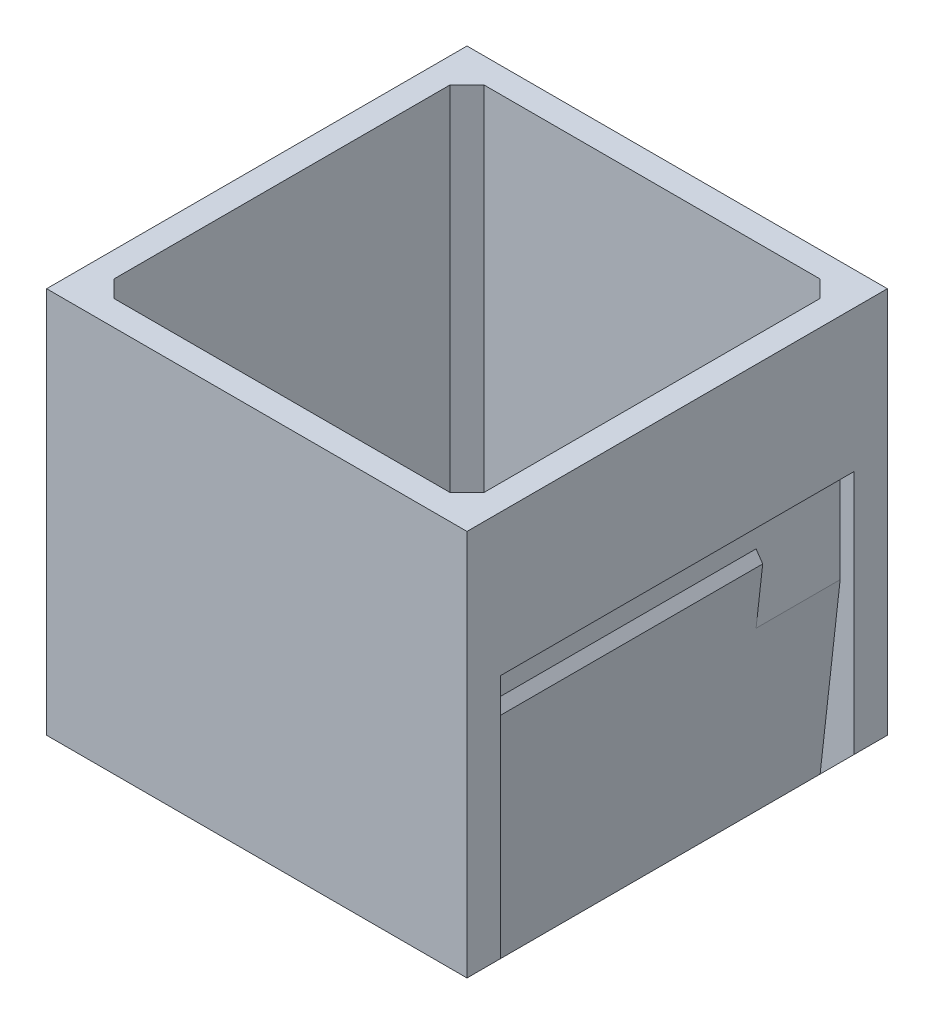
ISO-10303-21;
HEADER;
FILE_DESCRIPTION(('STEP AP214'),'2;1');
FILE_NAME('part.step','',(''),(''),'','','');
FILE_SCHEMA(('AUTOMOTIVE_DESIGN { 1 0 10303 214 1 1 1 1 }'));
ENDSEC;
DATA;
#1=APPLICATION_CONTEXT('core data for automotive mechanical design processes');
#2=APPLICATION_PROTOCOL_DEFINITION('international standard','automotive_design',2000,#1);
#3=PRODUCT_CONTEXT('',#1,'mechanical');
#4=PRODUCT('Part','Part','',(#3));
#5=PRODUCT_RELATED_PRODUCT_CATEGORY('part','',(#4));
#6=PRODUCT_DEFINITION_FORMATION('','',#4);
#7=PRODUCT_DEFINITION_CONTEXT('part definition',#1,'design');
#8=PRODUCT_DEFINITION('design','',#6,#7);
#9=PRODUCT_DEFINITION_SHAPE('','',#8);
#10=(LENGTH_UNIT() NAMED_UNIT(*) SI_UNIT(.MILLI.,.METRE.));
#11=(NAMED_UNIT(*) PLANE_ANGLE_UNIT() SI_UNIT($,.RADIAN.));
#12=(NAMED_UNIT(*) SI_UNIT($,.STERADIAN.) SOLID_ANGLE_UNIT());
#13=UNCERTAINTY_MEASURE_WITH_UNIT(LENGTH_MEASURE(1.E-05),#10,'distance_accuracy_value','');
#14=(GEOMETRIC_REPRESENTATION_CONTEXT(3) GLOBAL_UNCERTAINTY_ASSIGNED_CONTEXT((#13)) GLOBAL_UNIT_ASSIGNED_CONTEXT((#10,
#11,#12)) REPRESENTATION_CONTEXT('',''));
#15=CARTESIAN_POINT('',(0.,0.,0.));
#16=DIRECTION('',(0.,0.,1.));
#17=DIRECTION('',(1.,0.,0.));
#18=AXIS2_PLACEMENT_3D('',#15,#16,#17);
#19=CARTESIAN_POINT('',(0.,25.,0.));
#20=DIRECTION('',(0.,-1.,0.));
#21=DIRECTION('',(0.,0.,-1.));
#22=AXIS2_PLACEMENT_3D('',#19,#20,#21);
#23=PLANE('',#22);
#24=DIRECTION('',(0.,0.,-1.));
#25=VECTOR('',#24,1.);
#26=CARTESIAN_POINT('',(12.5,25.,12.5));
#27=LINE('',#26,#25);
#28=CARTESIAN_POINT('',(12.5,25.,12.5));
#29=VERTEX_POINT('',#28);
#30=CARTESIAN_POINT('',(12.5,25.,-12.5));
#31=VERTEX_POINT('',#30);
#32=EDGE_CURVE('E373',#29,#31,#27,.T.);
#33=ORIENTED_EDGE('',*,*,#32,.T.);
#34=DIRECTION('',(-1.,0.,0.));
#35=VECTOR('',#34,1.);
#36=CARTESIAN_POINT('',(-12.5,25.,-12.5));
#37=LINE('',#36,#35);
#38=CARTESIAN_POINT('',(-12.5,25.,-12.5));
#39=VERTEX_POINT('',#38);
#40=EDGE_CURVE('E377',#31,#39,#37,.T.);
#41=ORIENTED_EDGE('',*,*,#40,.T.);
#42=DIRECTION('',(0.,0.,1.));
#43=VECTOR('',#42,1.);
#44=CARTESIAN_POINT('',(-12.5,25.,12.5));
#45=LINE('',#44,#43);
#46=CARTESIAN_POINT('',(-12.5,25.,12.5));
#47=VERTEX_POINT('',#46);
#48=EDGE_CURVE('E381',#39,#47,#45,.T.);
#49=ORIENTED_EDGE('',*,*,#48,.T.);
#50=DIRECTION('',(1.,0.,0.));
#51=VECTOR('',#50,1.);
#52=CARTESIAN_POINT('',(-12.5,25.,12.5));
#53=LINE('',#52,#51);
#54=EDGE_CURVE('E384',#47,#29,#53,.T.);
#55=ORIENTED_EDGE('',*,*,#54,.T.);
#56=EDGE_LOOP('',(#33,#41,#49,#55));
#57=FACE_BOUND('',#56,.T.);
#58=DIRECTION('',(0.,0.,-1.));
#59=VECTOR('',#58,1.);
#60=CARTESIAN_POINT('',(11.,25.,0.));
#61=LINE('',#60,#59);
#62=CARTESIAN_POINT('',(11.,25.,10.));
#63=VERTEX_POINT('',#62);
#64=CARTESIAN_POINT('',(11.,25.,-9.99999999999998));
#65=VERTEX_POINT('',#64);
#66=EDGE_CURVE('E273',#63,#65,#61,.T.);
#67=ORIENTED_EDGE('',*,*,#66,.F.);
#68=DIRECTION('',(0.707106781186552,0.,-0.707106781186543));
#69=VECTOR('',#68,1.);
#70=CARTESIAN_POINT('',(10.4999999999999,25.,10.5000000000001));
#71=LINE('',#70,#69);
#72=CARTESIAN_POINT('',(9.99999999999999,25.,11.));
#73=VERTEX_POINT('',#72);
#74=EDGE_CURVE('E510',#63,#73,#71,.F.);
#75=ORIENTED_EDGE('',*,*,#74,.T.);
#76=DIRECTION('',(1.,0.,0.));
#77=VECTOR('',#76,1.);
#78=CARTESIAN_POINT('',(0.,25.,11.));
#79=LINE('',#78,#77);
#80=CARTESIAN_POINT('',(-9.99999999999999,25.,11.));
#81=VERTEX_POINT('',#80);
#82=EDGE_CURVE('E259',#81,#73,#79,.T.);
#83=ORIENTED_EDGE('',*,*,#82,.F.);
#84=DIRECTION('',(0.707106781186544,0.,0.707106781186551));
#85=VECTOR('',#84,1.);
#86=CARTESIAN_POINT('',(-10.5,25.,10.4999999999999));
#87=LINE('',#86,#85);
#88=CARTESIAN_POINT('',(-11.,25.,9.99999999999999));
#89=VERTEX_POINT('',#88);
#90=EDGE_CURVE('E513',#81,#89,#87,.F.);
#91=ORIENTED_EDGE('',*,*,#90,.T.);
#92=DIRECTION('',(0.,0.,1.));
#93=VECTOR('',#92,1.);
#94=CARTESIAN_POINT('',(-11.,25.,0.));
#95=LINE('',#94,#93);
#96=CARTESIAN_POINT('',(-11.,25.,-10.));
#97=VERTEX_POINT('',#96);
#98=EDGE_CURVE('E311',#97,#89,#95,.T.);
#99=ORIENTED_EDGE('',*,*,#98,.F.);
#100=DIRECTION('',(-0.707106781186549,0.,0.707106781186546));
#101=VECTOR('',#100,1.);
#102=CARTESIAN_POINT('',(-10.5,25.,-10.5));
#103=LINE('',#102,#101);
#104=CARTESIAN_POINT('',(-9.99999999999999,25.,-11.));
#105=VERTEX_POINT('',#104);
#106=EDGE_CURVE('E516',#97,#105,#103,.F.);
#107=ORIENTED_EDGE('',*,*,#106,.T.);
#108=DIRECTION('',(-1.,0.,0.));
#109=VECTOR('',#108,1.);
#110=CARTESIAN_POINT('',(0.,25.,-11.));
#111=LINE('',#110,#109);
#112=CARTESIAN_POINT('',(10.,25.,-11.));
#113=VERTEX_POINT('',#112);
#114=EDGE_CURVE('E307',#113,#105,#111,.T.);
#115=ORIENTED_EDGE('',*,*,#114,.F.);
#116=DIRECTION('',(-0.707106781186543,0.,-0.707106781186552));
#117=VECTOR('',#116,1.);
#118=CARTESIAN_POINT('',(10.5000000000001,25.,-10.4999999999999));
#119=LINE('',#118,#117);
#120=EDGE_CURVE('E51',#113,#65,#119,.F.);
#121=ORIENTED_EDGE('',*,*,#120,.T.);
#122=EDGE_LOOP('',(#67,#75,#83,#91,#99,#107,#115,#121));
#123=FACE_BOUND('',#122,.T.);
#124=ADVANCED_FACE('F41',(#57,#123),#23,.F.);
#125=CARTESIAN_POINT('',(12.5,25.,12.5));
#126=DIRECTION('',(-1.,0.,0.));
#127=DIRECTION('',(0.,0.,1.));
#128=AXIS2_PLACEMENT_3D('',#125,#126,#127);
#129=PLANE('',#128);
#130=DIRECTION('',(0.,1.,0.));
#131=VECTOR('',#130,1.);
#132=CARTESIAN_POINT('',(12.5,0.,-10.5));
#133=LINE('',#132,#131);
#134=CARTESIAN_POINT('',(12.5,2.00000000000001,-10.5));
#135=VERTEX_POINT('',#134);
#136=CARTESIAN_POINT('',(12.5,16.5764439763815,-10.5));
#137=VERTEX_POINT('',#136);
#138=EDGE_CURVE('E332',#135,#137,#133,.T.);
#139=ORIENTED_EDGE('',*,*,#138,.F.);
#140=DIRECTION('',(0.,0.,-1.));
#141=VECTOR('',#140,1.);
#142=CARTESIAN_POINT('',(12.5,2.00000000000001,-12.5));
#143=LINE('',#142,#141);
#144=CARTESIAN_POINT('',(12.5,2.00000000000001,-12.5));
#145=VERTEX_POINT('',#144);
#146=EDGE_CURVE('E426',#135,#145,#143,.T.);
#147=ORIENTED_EDGE('',*,*,#146,.T.);
#148=DIRECTION('',(0.,-1.,0.));
#149=VECTOR('',#148,1.);
#150=CARTESIAN_POINT('',(12.5,25.,-12.5));
#151=LINE('',#150,#149);
#152=EDGE_CURVE('E399',#31,#145,#151,.T.);
#153=ORIENTED_EDGE('',*,*,#152,.F.);
#154=ORIENTED_EDGE('',*,*,#32,.F.);
#155=DIRECTION('',(0.,-1.,0.));
#156=VECTOR('',#155,1.);
#157=CARTESIAN_POINT('',(12.5,25.,12.5));
#158=LINE('',#157,#156);
#159=CARTESIAN_POINT('',(12.5,2.00000000000001,12.5));
#160=VERTEX_POINT('',#159);
#161=EDGE_CURVE('E387',#29,#160,#158,.T.);
#162=ORIENTED_EDGE('',*,*,#161,.T.);
#163=CARTESIAN_POINT('',(12.5,2.00000000000001,10.5));
#164=VERTEX_POINT('',#163);
#165=EDGE_CURVE('E427',#160,#164,#143,.T.);
#166=ORIENTED_EDGE('',*,*,#165,.T.);
#167=DIRECTION('',(0.,1.,0.));
#168=VECTOR('',#167,1.);
#169=CARTESIAN_POINT('',(12.5,0.,10.5));
#170=LINE('',#169,#168);
#171=CARTESIAN_POINT('',(12.5,16.5764439763815,10.5));
#172=VERTEX_POINT('',#171);
#173=EDGE_CURVE('E348',#164,#172,#170,.T.);
#174=ORIENTED_EDGE('',*,*,#173,.T.);
#175=DIRECTION('',(0.,0.,1.));
#176=VECTOR('',#175,1.);
#177=CARTESIAN_POINT('',(12.5,16.5764439763815,-10.5));
#178=LINE('',#177,#176);
#179=EDGE_CURVE('E364',#137,#172,#178,.T.);
#180=ORIENTED_EDGE('',*,*,#179,.F.);
#181=EDGE_LOOP('',(#139,#147,#153,#154,#162,#166,#174,#180));
#182=FACE_BOUND('',#181,.T.);
#183=ADVANCED_FACE('F585',(#182),#129,.F.);
#184=CARTESIAN_POINT('',(12.5,2.00000000000001,12.5));
#185=DIRECTION('',(0.707106781186547,-0.707106781186548,0.));
#186=DIRECTION('',(0.,0.,1.));
#187=AXIS2_PLACEMENT_3D('',#184,#185,#186);
#188=PLANE('',#187);
#189=ORIENTED_EDGE('',*,*,#146,.F.);
#190=DIRECTION('',(-0.707106781186548,-0.707106781186547,0.));
#191=VECTOR('',#190,1.);
#192=CARTESIAN_POINT('',(12.5,2.00000000000001,-10.5));
#193=LINE('',#192,#191);
#194=CARTESIAN_POINT('',(10.5,0.,-10.5));
#195=VERTEX_POINT('',#194);
#196=EDGE_CURVE('E360',#135,#195,#193,.T.);
#197=ORIENTED_EDGE('',*,*,#196,.T.);
#198=DIRECTION('',(0.577350269189626,0.577350269189625,-0.577350269189626));
#199=VECTOR('',#198,1.);
#200=CARTESIAN_POINT('',(4.16666666666666,-6.33333333333332,-4.16666666666666));
#201=LINE('',#200,#199);
#202=EDGE_CURVE('E434',#145,#195,#201,.F.);
#203=ORIENTED_EDGE('',*,*,#202,.F.);
#204=EDGE_LOOP('',(#189,#197,#203));
#205=FACE_BOUND('',#204,.T.);
#206=ADVANCED_FACE('F591',(#205),#188,.T.);
#207=CARTESIAN_POINT('',(-12.5,25.,-12.5));
#208=DIRECTION('',(0.,0.,1.));
#209=DIRECTION('',(1.,0.,0.));
#210=AXIS2_PLACEMENT_3D('',#207,#208,#209);
#211=PLANE('',#210);
#212=ORIENTED_EDGE('',*,*,#152,.T.);
#213=DIRECTION('',(-1.,0.,0.));
#214=VECTOR('',#213,1.);
#215=CARTESIAN_POINT('',(-12.5,2.00000000000001,-12.5));
#216=LINE('',#215,#214);
#217=CARTESIAN_POINT('',(-12.5,2.00000000000001,-12.5));
#218=VERTEX_POINT('',#217);
#219=EDGE_CURVE('E403',#145,#218,#216,.T.);
#220=ORIENTED_EDGE('',*,*,#219,.T.);
#221=DIRECTION('',(0.,-1.,0.));
#222=VECTOR('',#221,1.);
#223=CARTESIAN_POINT('',(-12.5,25.,-12.5));
#224=LINE('',#223,#222);
#225=EDGE_CURVE('E395',#39,#218,#224,.T.);
#226=ORIENTED_EDGE('',*,*,#225,.F.);
#227=ORIENTED_EDGE('',*,*,#40,.F.);
#228=EDGE_LOOP('',(#212,#220,#226,#227));
#229=FACE_BOUND('',#228,.T.);
#230=ADVANCED_FACE('F610',(#229),#211,.F.);
#231=CARTESIAN_POINT('',(-12.5,25.,12.5));
#232=DIRECTION('',(1.,0.,0.));
#233=DIRECTION('',(0.,0.,-1.));
#234=AXIS2_PLACEMENT_3D('',#231,#232,#233);
#235=PLANE('',#234);
#236=ORIENTED_EDGE('',*,*,#225,.T.);
#237=DIRECTION('',(0.,0.,1.));
#238=VECTOR('',#237,1.);
#239=CARTESIAN_POINT('',(-12.5,2.00000000000001,12.5));
#240=LINE('',#239,#238);
#241=CARTESIAN_POINT('',(-12.5,2.00000000000001,12.5));
#242=VERTEX_POINT('',#241);
#243=EDGE_CURVE('E420',#218,#242,#240,.T.);
#244=ORIENTED_EDGE('',*,*,#243,.T.);
#245=DIRECTION('',(0.,-1.,0.));
#246=VECTOR('',#245,1.);
#247=CARTESIAN_POINT('',(-12.5,25.,12.5));
#248=LINE('',#247,#246);
#249=EDGE_CURVE('E391',#47,#242,#248,.T.);
#250=ORIENTED_EDGE('',*,*,#249,.F.);
#251=ORIENTED_EDGE('',*,*,#48,.F.);
#252=EDGE_LOOP('',(#236,#244,#250,#251));
#253=FACE_BOUND('',#252,.T.);
#254=ADVANCED_FACE('F606',(#253),#235,.F.);
#255=CARTESIAN_POINT('',(-12.5,25.,12.5));
#256=DIRECTION('',(0.,0.,-1.));
#257=DIRECTION('',(-1.,0.,0.));
#258=AXIS2_PLACEMENT_3D('',#255,#256,#257);
#259=PLANE('',#258);
#260=ORIENTED_EDGE('',*,*,#249,.T.);
#261=DIRECTION('',(1.,0.,0.));
#262=VECTOR('',#261,1.);
#263=CARTESIAN_POINT('',(12.5,2.00000000000001,12.5));
#264=LINE('',#263,#262);
#265=EDGE_CURVE('E423',#242,#160,#264,.T.);
#266=ORIENTED_EDGE('',*,*,#265,.T.);
#267=ORIENTED_EDGE('',*,*,#161,.F.);
#268=ORIENTED_EDGE('',*,*,#54,.F.);
#269=EDGE_LOOP('',(#260,#266,#267,#268));
#270=FACE_BOUND('',#269,.T.);
#271=ADVANCED_FACE('F602',(#270),#259,.F.);
#272=CARTESIAN_POINT('',(0.,0.,0.));
#273=DIRECTION('',(0.,-1.,0.));
#274=DIRECTION('',(0.,0.,-1.));
#275=AXIS2_PLACEMENT_3D('',#272,#273,#274);
#276=PLANE('',#275);
#277=DIRECTION('',(0.,0.,-1.));
#278=VECTOR('',#277,1.);
#279=CARTESIAN_POINT('',(-10.5,0.,-12.5));
#280=LINE('',#279,#278);
#281=CARTESIAN_POINT('',(-10.5,0.,10.5));
#282=VERTEX_POINT('',#281);
#283=CARTESIAN_POINT('',(-10.5,0.,-10.5));
#284=VERTEX_POINT('',#283);
#285=EDGE_CURVE('E413',#282,#284,#280,.T.);
#286=ORIENTED_EDGE('',*,*,#285,.T.);
#287=DIRECTION('',(1.,0.,0.));
#288=VECTOR('',#287,1.);
#289=CARTESIAN_POINT('',(12.5,0.,-10.5));
#290=LINE('',#289,#288);
#291=EDGE_CURVE('E416',#284,#195,#290,.T.);
#292=ORIENTED_EDGE('',*,*,#291,.T.);
#293=DIRECTION('',(0.,0.,1.));
#294=VECTOR('',#293,1.);
#295=CARTESIAN_POINT('',(10.5,0.,12.5));
#296=LINE('',#295,#294);
#297=CARTESIAN_POINT('',(10.5,0.,10.5));
#298=VERTEX_POINT('',#297);
#299=EDGE_CURVE('E407',#195,#298,#296,.T.);
#300=ORIENTED_EDGE('',*,*,#299,.T.);
#301=DIRECTION('',(-1.,0.,0.));
#302=VECTOR('',#301,1.);
#303=CARTESIAN_POINT('',(-12.5,0.,10.5));
#304=LINE('',#303,#302);
#305=EDGE_CURVE('E410',#298,#282,#304,.T.);
#306=ORIENTED_EDGE('',*,*,#305,.T.);
#307=EDGE_LOOP('',(#286,#292,#300,#306));
#308=FACE_BOUND('',#307,.T.);
#309=ADVANCED_FACE('F598',(#308),#276,.T.);
#310=CARTESIAN_POINT('',(-12.5,2.00000000000001,12.5));
#311=DIRECTION('',(0.,-0.707106781186548,0.707106781186547));
#312=DIRECTION('',(-1.,0.,0.));
#313=AXIS2_PLACEMENT_3D('',#310,#311,#312);
#314=PLANE('',#313);
#315=DIRECTION('',(0.577350269189626,-0.577350269189625,-0.577350269189626));
#316=VECTOR('',#315,1.);
#317=CARTESIAN_POINT('',(-12.5,2.00000000000001,12.5));
#318=LINE('',#317,#316);
#319=EDGE_CURVE('E438',#282,#242,#318,.F.);
#320=ORIENTED_EDGE('',*,*,#319,.F.);
#321=ORIENTED_EDGE('',*,*,#305,.F.);
#322=DIRECTION('',(-0.577350269189626,-0.577350269189625,-0.577350269189626));
#323=VECTOR('',#322,1.);
#324=CARTESIAN_POINT('',(12.5,2.00000000000001,12.5));
#325=LINE('',#324,#323);
#326=EDGE_CURVE('E378',#160,#298,#325,.T.);
#327=ORIENTED_EDGE('',*,*,#326,.F.);
#328=ORIENTED_EDGE('',*,*,#265,.F.);
#329=EDGE_LOOP('',(#320,#321,#327,#328));
#330=FACE_BOUND('',#329,.T.);
#331=ADVANCED_FACE('F601',(#330),#314,.T.);
#332=DIRECTION('',(-0.707106781186548,-0.707106781186547,0.));
#333=VECTOR('',#332,1.);
#334=CARTESIAN_POINT('',(12.5,2.00000000000001,10.5));
#335=LINE('',#334,#333);
#336=EDGE_CURVE('E431',#164,#298,#335,.T.);
#337=ORIENTED_EDGE('',*,*,#336,.F.);
#338=ORIENTED_EDGE('',*,*,#165,.F.);
#339=ORIENTED_EDGE('',*,*,#326,.T.);
#340=EDGE_LOOP('',(#337,#338,#339));
#341=FACE_BOUND('',#340,.T.);
#342=ADVANCED_FACE('F630',(#341),#188,.T.);
#343=CARTESIAN_POINT('',(-12.5,2.00000000000001,12.5));
#344=DIRECTION('',(-0.707106781186547,-0.707106781186548,0.));
#345=DIRECTION('',(0.,0.,-1.));
#346=AXIS2_PLACEMENT_3D('',#343,#344,#345);
#347=PLANE('',#346);
#348=ORIENTED_EDGE('',*,*,#319,.T.);
#349=ORIENTED_EDGE('',*,*,#243,.F.);
#350=DIRECTION('',(0.577350269189626,-0.577350269189625,0.577350269189626));
#351=VECTOR('',#350,1.);
#352=CARTESIAN_POINT('',(-4.16666666666666,-6.33333333333332,-4.16666666666666));
#353=LINE('',#352,#351);
#354=EDGE_CURVE('E372',#284,#218,#353,.F.);
#355=ORIENTED_EDGE('',*,*,#354,.F.);
#356=ORIENTED_EDGE('',*,*,#285,.F.);
#357=EDGE_LOOP('',(#348,#349,#355,#356));
#358=FACE_BOUND('',#357,.T.);
#359=ADVANCED_FACE('F623',(#358),#347,.T.);
#360=CARTESIAN_POINT('',(-12.5,2.00000000000001,-12.5));
#361=DIRECTION('',(0.,-0.707106781186548,-0.707106781186547));
#362=DIRECTION('',(1.,0.,0.));
#363=AXIS2_PLACEMENT_3D('',#360,#361,#362);
#364=PLANE('',#363);
#365=ORIENTED_EDGE('',*,*,#202,.T.);
#366=ORIENTED_EDGE('',*,*,#291,.F.);
#367=ORIENTED_EDGE('',*,*,#354,.T.);
#368=ORIENTED_EDGE('',*,*,#219,.F.);
#369=EDGE_LOOP('',(#365,#366,#367,#368));
#370=FACE_BOUND('',#369,.T.);
#371=ADVANCED_FACE('F616',(#370),#364,.T.);
#372=CARTESIAN_POINT('',(14.8269046866479,10.091042738514,-10.5));
#373=DIRECTION('',(-0.826699643454396,-0.562643492375389,0.));
#374=DIRECTION('',(0.56264349237539,-0.826699643454396,0.));
#375=AXIS2_PLACEMENT_3D('',#372,#373,#374);
#376=PLANE('',#375);
#377=DIRECTION('',(0.,0.,1.));
#378=VECTOR('',#377,1.);
#379=CARTESIAN_POINT('',(12.0854329184135,14.1191240440871,-10.5));
#380=LINE('',#379,#378);
#381=CARTESIAN_POINT('',(12.0854329184135,14.1191240440871,-5.5));
#382=VERTEX_POINT('',#381);
#383=CARTESIAN_POINT('',(12.0854329184135,14.1191240440871,10.5));
#384=VERTEX_POINT('',#383);
#385=EDGE_CURVE('E341',#382,#384,#380,.T.);
#386=ORIENTED_EDGE('',*,*,#385,.F.);
#387=DIRECTION('',(-0.56264349237539,0.826699643454396,0.));
#388=VECTOR('',#387,1.);
#389=CARTESIAN_POINT('',(14.8269046866479,10.091042738514,-5.5));
#390=LINE('',#389,#388);
#391=CARTESIAN_POINT('',(11.6914188235508,14.6980542479428,-5.5));
#392=VERTEX_POINT('',#391);
#393=EDGE_CURVE('E226',#382,#392,#390,.T.);
#394=ORIENTED_EDGE('',*,*,#393,.T.);
#395=DIRECTION('',(0.,0.,1.));
#396=VECTOR('',#395,1.);
#397=CARTESIAN_POINT('',(11.6914188235508,14.6980542479428,-10.5));
#398=LINE('',#397,#396);
#399=CARTESIAN_POINT('',(11.6914188235508,14.6980542479428,10.5));
#400=VERTEX_POINT('',#399);
#401=EDGE_CURVE('E236',#392,#400,#398,.T.);
#402=ORIENTED_EDGE('',*,*,#401,.T.);
#403=DIRECTION('',(0.562643492375389,-0.826699643454396,0.));
#404=VECTOR('',#403,1.);
#405=CARTESIAN_POINT('',(14.8269046866479,10.091042738514,10.5));
#406=LINE('',#405,#404);
#407=EDGE_CURVE('E329',#400,#384,#406,.T.);
#408=ORIENTED_EDGE('',*,*,#407,.T.);
#409=EDGE_LOOP('',(#386,#394,#402,#408));
#410=FACE_BOUND('',#409,.T.);
#411=ADVANCED_FACE('F596',(#410),#376,.F.);
#412=CARTESIAN_POINT('',(11.6914188235508,0.,-10.5));
#413=DIRECTION('',(-1.,0.,0.));
#414=DIRECTION('',(0.,0.,1.));
#415=AXIS2_PLACEMENT_3D('',#412,#413,#414);
#416=PLANE('',#415);
#417=ORIENTED_EDGE('',*,*,#401,.F.);
#418=DIRECTION('',(0.,-1.,0.));
#419=VECTOR('',#418,1.);
#420=CARTESIAN_POINT('',(11.6914188235508,15.7980542479428,-5.5));
#421=LINE('',#420,#419);
#422=CARTESIAN_POINT('',(11.6914188235508,10.6102188006838,-5.5));
#423=VERTEX_POINT('',#422);
#424=EDGE_CURVE('E224',#392,#423,#421,.T.);
#425=ORIENTED_EDGE('',*,*,#424,.T.);
#426=DIRECTION('',(0.,0.,-1.));
#427=VECTOR('',#426,1.);
#428=CARTESIAN_POINT('',(11.6914188235508,10.6102188006838,-5.5));
#429=LINE('',#428,#427);
#430=CARTESIAN_POINT('',(11.6914188235508,10.6102188006838,-10.5));
#431=VERTEX_POINT('',#430);
#432=EDGE_CURVE('E233',#423,#431,#429,.T.);
#433=ORIENTED_EDGE('',*,*,#432,.T.);
#434=DIRECTION('',(0.,-1.,0.));
#435=VECTOR('',#434,1.);
#436=CARTESIAN_POINT('',(11.6914188235508,0.,-10.5));
#437=LINE('',#436,#435);
#438=CARTESIAN_POINT('',(11.6914188235508,15.7980542479428,-10.5));
#439=VERTEX_POINT('',#438);
#440=EDGE_CURVE('E58',#439,#431,#437,.T.);
#441=ORIENTED_EDGE('',*,*,#440,.F.);
#442=DIRECTION('',(0.,0.,1.));
#443=VECTOR('',#442,1.);
#444=CARTESIAN_POINT('',(11.6914188235508,15.7980542479428,-10.5));
#445=LINE('',#444,#443);
#446=CARTESIAN_POINT('',(11.6914188235508,15.7980542479428,10.5));
#447=VERTEX_POINT('',#446);
#448=EDGE_CURVE('E361',#439,#447,#445,.T.);
#449=ORIENTED_EDGE('',*,*,#448,.T.);
#450=DIRECTION('',(0.,-1.,0.));
#451=VECTOR('',#450,1.);
#452=CARTESIAN_POINT('',(11.6914188235508,0.,10.5));
#453=LINE('',#452,#451);
#454=EDGE_CURVE('E333',#447,#400,#453,.T.);
#455=ORIENTED_EDGE('',*,*,#454,.T.);
#456=EDGE_LOOP('',(#417,#425,#433,#441,#449,#455));
#457=FACE_BOUND('',#456,.T.);
#458=ADVANCED_FACE('F232',(#457),#416,.F.);
#459=CARTESIAN_POINT('',(-2.26994572821764,2.35799024619662,-10.5));
#460=DIRECTION('',(-0.693528880093428,0.720428825406338,0.));
#461=DIRECTION('',(-0.720428825406338,-0.693528880093428,0.));
#462=AXIS2_PLACEMENT_3D('',#459,#460,#461);
#463=PLANE('',#462);
#464=DIRECTION('',(-0.720428825406338,-0.693528880093428,0.));
#465=VECTOR('',#464,1.);
#466=CARTESIAN_POINT('',(-2.26994572821764,2.35799024619662,10.5));
#467=LINE('',#466,#465);
#468=EDGE_CURVE('E352',#172,#447,#467,.T.);
#469=ORIENTED_EDGE('',*,*,#468,.T.);
#470=ORIENTED_EDGE('',*,*,#448,.F.);
#471=DIRECTION('',(-0.720428825406338,-0.693528880093428,0.));
#472=VECTOR('',#471,1.);
#473=CARTESIAN_POINT('',(-2.26994572821764,2.35799024619662,-10.5));
#474=LINE('',#473,#472);
#475=EDGE_CURVE('E336',#137,#439,#474,.T.);
#476=ORIENTED_EDGE('',*,*,#475,.F.);
#477=ORIENTED_EDGE('',*,*,#179,.T.);
#478=EDGE_LOOP('',(#469,#470,#476,#477));
#479=FACE_BOUND('',#478,.T.);
#480=ADVANCED_FACE('F771',(#479),#463,.F.);
#481=CARTESIAN_POINT('',(10.3692541971934,-1.16436096830755,-10.5));
#482=DIRECTION('',(-0.993754506294347,0.111588445726604,0.));
#483=DIRECTION('',(-0.111588445726604,-0.993754506294347,0.));
#484=AXIS2_PLACEMENT_3D('',#481,#482,#483);
#485=PLANE('',#484);
#486=DIRECTION('',(-0.111588445726604,-0.993754506294347,0.));
#487=VECTOR('',#486,1.);
#488=CARTESIAN_POINT('',(10.3692541971934,-1.16436096830755,10.5));
#489=LINE('',#488,#487);
#490=EDGE_CURVE('E345',#384,#298,#489,.T.);
#491=ORIENTED_EDGE('',*,*,#490,.T.);
#492=ORIENTED_EDGE('',*,*,#299,.F.);
#493=DIRECTION('',(-0.111588445726604,-0.993754506294347,0.));
#494=VECTOR('',#493,1.);
#495=CARTESIAN_POINT('',(10.3692541971934,-1.16436096830755,-10.5));
#496=LINE('',#495,#494);
#497=EDGE_CURVE('E242',#431,#195,#496,.T.);
#498=ORIENTED_EDGE('',*,*,#497,.F.);
#499=ORIENTED_EDGE('',*,*,#432,.F.);
#500=DIRECTION('',(0.111588445726604,0.993754506294347,0.));
#501=VECTOR('',#500,1.);
#502=CARTESIAN_POINT('',(10.3692541971934,-1.16436096830755,-5.5));
#503=LINE('',#502,#501);
#504=EDGE_CURVE('E11',#423,#382,#503,.T.);
#505=ORIENTED_EDGE('',*,*,#504,.T.);
#506=ORIENTED_EDGE('',*,*,#385,.T.);
#507=EDGE_LOOP('',(#491,#492,#498,#499,#505,#506));
#508=FACE_BOUND('',#507,.T.);
#509=ADVANCED_FACE('F240',(#508),#485,.F.);
#510=CARTESIAN_POINT('',(0.,0.,-10.5));
#511=DIRECTION('',(0.,0.,1.));
#512=DIRECTION('',(1.,0.,0.));
#513=AXIS2_PLACEMENT_3D('',#510,#511,#512);
#514=PLANE('',#513);
#515=ORIENTED_EDGE('',*,*,#138,.T.);
#516=ORIENTED_EDGE('',*,*,#475,.T.);
#517=ORIENTED_EDGE('',*,*,#440,.T.);
#518=ORIENTED_EDGE('',*,*,#497,.T.);
#519=ORIENTED_EDGE('',*,*,#196,.F.);
#520=EDGE_LOOP('',(#515,#516,#517,#518,#519));
#521=FACE_BOUND('',#520,.T.);
#522=ADVANCED_FACE('F790',(#521),#514,.T.);
#523=CARTESIAN_POINT('',(0.,0.,10.5));
#524=DIRECTION('',(0.,0.,1.));
#525=DIRECTION('',(1.,0.,0.));
#526=AXIS2_PLACEMENT_3D('',#523,#524,#525);
#527=PLANE('',#526);
#528=ORIENTED_EDGE('',*,*,#336,.T.);
#529=ORIENTED_EDGE('',*,*,#490,.F.);
#530=ORIENTED_EDGE('',*,*,#407,.F.);
#531=ORIENTED_EDGE('',*,*,#454,.F.);
#532=ORIENTED_EDGE('',*,*,#468,.F.);
#533=ORIENTED_EDGE('',*,*,#173,.F.);
#534=EDGE_LOOP('',(#528,#529,#530,#531,#532,#533));
#535=FACE_BOUND('',#534,.T.);
#536=ADVANCED_FACE('F797',(#535),#527,.F.);
#537=CARTESIAN_POINT('',(10.1914188235508,0.,-10.5));
#538=DIRECTION('',(-1.,0.,0.));
#539=DIRECTION('',(0.,0.,1.));
#540=AXIS2_PLACEMENT_3D('',#537,#538,#539);
#541=PLANE('',#540);
#542=DIRECTION('',(0.,0.,1.));
#543=VECTOR('',#542,1.);
#544=CARTESIAN_POINT('',(10.1914188235508,14.2360378230821,-10.5));
#545=LINE('',#544,#543);
#546=CARTESIAN_POINT('',(10.1914188235508,14.2360378230821,-10.8085811764492));
#547=VERTEX_POINT('',#546);
#548=CARTESIAN_POINT('',(10.1914188235508,14.2360378230821,10.8085811764492));
#549=VERTEX_POINT('',#548);
#550=EDGE_CURVE('E293',#547,#549,#545,.T.);
#551=ORIENTED_EDGE('',*,*,#550,.T.);
#552=DIRECTION('',(0.,-1.,0.));
#553=VECTOR('',#552,1.);
#554=CARTESIAN_POINT('',(10.1914188235508,0.,10.8085811764492));
#555=LINE('',#554,#553);
#556=CARTESIAN_POINT('',(10.1914188235508,16.4361557003668,10.8085811764492));
#557=VERTEX_POINT('',#556);
#558=EDGE_CURVE('E470',#549,#557,#555,.F.);
#559=ORIENTED_EDGE('',*,*,#558,.T.);
#560=DIRECTION('',(0.,0.,1.));
#561=VECTOR('',#560,1.);
#562=CARTESIAN_POINT('',(10.1914188235508,16.4361557003668,-10.5));
#563=LINE('',#562,#561);
#564=CARTESIAN_POINT('',(10.1914188235508,16.4361557003668,-10.8085811764492));
#565=VERTEX_POINT('',#564);
#566=EDGE_CURVE('E253',#565,#557,#563,.T.);
#567=ORIENTED_EDGE('',*,*,#566,.F.);
#568=DIRECTION('',(0.,1.,0.));
#569=VECTOR('',#568,1.);
#570=CARTESIAN_POINT('',(10.1914188235508,0.,-10.8085811764492));
#571=LINE('',#570,#569);
#572=EDGE_CURVE('E467',#565,#547,#571,.F.);
#573=ORIENTED_EDGE('',*,*,#572,.T.);
#574=EDGE_LOOP('',(#551,#559,#567,#573));
#575=FACE_BOUND('',#574,.T.);
#576=ADVANCED_FACE('F538',(#575),#541,.T.);
#577=CARTESIAN_POINT('',(11.,25.,12.5));
#578=DIRECTION('',(-1.,0.,0.));
#579=DIRECTION('',(0.,0.,1.));
#580=AXIS2_PLACEMENT_3D('',#577,#578,#579);
#581=PLANE('',#580);
#582=DIRECTION('',(0.,0.,1.));
#583=VECTOR('',#582,1.);
#584=CARTESIAN_POINT('',(11.,17.2145454288055,-10.5));
#585=LINE('',#584,#583);
#586=CARTESIAN_POINT('',(11.,17.2145454288055,-9.99999999999998));
#587=VERTEX_POINT('',#586);
#588=CARTESIAN_POINT('',(11.,17.2145454288055,10.));
#589=VERTEX_POINT('',#588);
#590=EDGE_CURVE('E249',#587,#589,#585,.T.);
#591=ORIENTED_EDGE('',*,*,#590,.T.);
#592=DIRECTION('',(0.,1.,0.));
#593=VECTOR('',#592,1.);
#594=CARTESIAN_POINT('',(11.,25.,10.));
#595=LINE('',#594,#593);
#596=EDGE_CURVE('E483',#589,#63,#595,.T.);
#597=ORIENTED_EDGE('',*,*,#596,.T.);
#598=ORIENTED_EDGE('',*,*,#66,.T.);
#599=DIRECTION('',(0.,-1.,0.));
#600=VECTOR('',#599,1.);
#601=CARTESIAN_POINT('',(11.,17.2145454288055,-9.99999999999998));
#602=LINE('',#601,#600);
#603=EDGE_CURVE('E479',#65,#587,#602,.T.);
#604=ORIENTED_EDGE('',*,*,#603,.T.);
#605=EDGE_LOOP('',(#591,#597,#598,#604));
#606=FACE_BOUND('',#605,.T.);
#607=ADVANCED_FACE('F528',(#606),#581,.T.);
#608=CARTESIAN_POINT('',(-12.5,25.,-11.));
#609=DIRECTION('',(0.,0.,1.));
#610=DIRECTION('',(1.,0.,0.));
#611=AXIS2_PLACEMENT_3D('',#608,#609,#610);
#612=PLANE('',#611);
#613=ORIENTED_EDGE('',*,*,#114,.T.);
#614=DIRECTION('',(0.,-1.,0.));
#615=VECTOR('',#614,1.);
#616=CARTESIAN_POINT('',(-9.99999999999999,2.62132034355965,-11.));
#617=LINE('',#616,#615);
#618=CARTESIAN_POINT('',(-9.99999999999999,2.62132034355965,-11.));
#619=VERTEX_POINT('',#618);
#620=EDGE_CURVE('E505',#105,#619,#617,.T.);
#621=ORIENTED_EDGE('',*,*,#620,.T.);
#622=DIRECTION('',(-1.,0.,0.));
#623=VECTOR('',#622,1.);
#624=CARTESIAN_POINT('',(-12.5,2.62132034355965,-11.));
#625=LINE('',#624,#623);
#626=CARTESIAN_POINT('',(9.28492029020998,2.62132034355965,-11.));
#627=VERTEX_POINT('',#626);
#628=EDGE_CURVE('E254',#627,#619,#625,.T.);
#629=ORIENTED_EDGE('',*,*,#628,.F.);
#630=DIRECTION('',(0.111588445726604,0.993754506294347,0.));
#631=VECTOR('',#630,1.);
#632=CARTESIAN_POINT('',(8.87862243775184,-0.996978299717642,-11.));
#633=LINE('',#632,#631);
#634=CARTESIAN_POINT('',(10.,8.98948578700096,-11.));
#635=VERTEX_POINT('',#634);
#636=EDGE_CURVE('E303',#627,#635,#633,.T.);
#637=ORIENTED_EDGE('',*,*,#636,.T.);
#638=DIRECTION('',(0.,1.,0.));
#639=VECTOR('',#638,1.);
#640=CARTESIAN_POINT('',(10.,25.,-11.));
#641=LINE('',#640,#639);
#642=EDGE_CURVE('E502',#635,#113,#641,.T.);
#643=ORIENTED_EDGE('',*,*,#642,.T.);
#644=EDGE_LOOP('',(#613,#621,#629,#637,#643));
#645=FACE_BOUND('',#644,.T.);
#646=ADVANCED_FACE('F564',(#645),#612,.T.);
#647=CARTESIAN_POINT('',(-11.,25.,12.5));
#648=DIRECTION('',(1.,0.,0.));
#649=DIRECTION('',(0.,0.,-1.));
#650=AXIS2_PLACEMENT_3D('',#647,#648,#649);
#651=PLANE('',#650);
#652=ORIENTED_EDGE('',*,*,#98,.T.);
#653=DIRECTION('',(0.,-1.,0.));
#654=VECTOR('',#653,1.);
#655=CARTESIAN_POINT('',(-11.,2.62132034355965,9.99999999999999));
#656=LINE('',#655,#654);
#657=CARTESIAN_POINT('',(-11.,2.62132034355965,9.99999999999999));
#658=VERTEX_POINT('',#657);
#659=EDGE_CURVE('E489',#89,#658,#656,.T.);
#660=ORIENTED_EDGE('',*,*,#659,.T.);
#661=DIRECTION('',(0.,0.,1.));
#662=VECTOR('',#661,1.);
#663=CARTESIAN_POINT('',(-11.,2.62132034355965,12.5));
#664=LINE('',#663,#662);
#665=CARTESIAN_POINT('',(-11.,2.62132034355965,-10.));
#666=VERTEX_POINT('',#665);
#667=EDGE_CURVE('E260',#666,#658,#664,.T.);
#668=ORIENTED_EDGE('',*,*,#667,.F.);
#669=DIRECTION('',(0.,1.,0.));
#670=VECTOR('',#669,1.);
#671=CARTESIAN_POINT('',(-11.,25.,-10.));
#672=LINE('',#671,#670);
#673=EDGE_CURVE('E486',#666,#97,#672,.T.);
#674=ORIENTED_EDGE('',*,*,#673,.T.);
#675=EDGE_LOOP('',(#652,#660,#668,#674));
#676=FACE_BOUND('',#675,.T.);
#677=ADVANCED_FACE('F559',(#676),#651,.T.);
#678=CARTESIAN_POINT('',(-12.5,25.,11.));
#679=DIRECTION('',(0.,0.,-1.));
#680=DIRECTION('',(-1.,0.,0.));
#681=AXIS2_PLACEMENT_3D('',#678,#679,#680);
#682=PLANE('',#681);
#683=ORIENTED_EDGE('',*,*,#82,.T.);
#684=DIRECTION('',(0.,-1.,0.));
#685=VECTOR('',#684,1.);
#686=CARTESIAN_POINT('',(9.99999999999999,17.2145454288055,11.));
#687=LINE('',#686,#685);
#688=CARTESIAN_POINT('',(9.99999999999999,8.98948578700089,11.));
#689=VERTEX_POINT('',#688);
#690=EDGE_CURVE('E451',#73,#689,#687,.T.);
#691=ORIENTED_EDGE('',*,*,#690,.T.);
#692=DIRECTION('',(-0.111588445726604,-0.993754506294347,0.));
#693=VECTOR('',#692,1.);
#694=CARTESIAN_POINT('',(8.87862243775184,-0.996978299717642,11.));
#695=LINE('',#694,#693);
#696=CARTESIAN_POINT('',(9.28492029020998,2.62132034355965,11.));
#697=VERTEX_POINT('',#696);
#698=EDGE_CURVE('E321',#689,#697,#695,.T.);
#699=ORIENTED_EDGE('',*,*,#698,.T.);
#700=DIRECTION('',(1.,0.,0.));
#701=VECTOR('',#700,1.);
#702=CARTESIAN_POINT('',(-12.5,2.62132034355965,11.));
#703=LINE('',#702,#701);
#704=CARTESIAN_POINT('',(-9.99999999999999,2.62132034355965,11.));
#705=VERTEX_POINT('',#704);
#706=EDGE_CURVE('E264',#705,#697,#703,.T.);
#707=ORIENTED_EDGE('',*,*,#706,.F.);
#708=DIRECTION('',(0.,1.,0.));
#709=VECTOR('',#708,1.);
#710=CARTESIAN_POINT('',(-9.99999999999999,25.,11.));
#711=LINE('',#710,#709);
#712=EDGE_CURVE('E448',#705,#81,#711,.T.);
#713=ORIENTED_EDGE('',*,*,#712,.T.);
#714=EDGE_LOOP('',(#683,#691,#699,#707,#713));
#715=FACE_BOUND('',#714,.T.);
#716=ADVANCED_FACE('F548',(#715),#682,.T.);
#717=CARTESIAN_POINT('',(0.,1.5,0.));
#718=DIRECTION('',(0.,-1.,0.));
#719=DIRECTION('',(0.,0.,-1.));
#720=AXIS2_PLACEMENT_3D('',#717,#718,#719);
#721=PLANE('',#720);
#722=DIRECTION('',(0.,0.,-1.));
#723=VECTOR('',#722,1.);
#724=CARTESIAN_POINT('',(-9.87867965644034,1.5,0.));
#725=LINE('',#724,#723);
#726=CARTESIAN_POINT('',(-9.87867965644034,1.5,9.87867965644035));
#727=VERTEX_POINT('',#726);
#728=CARTESIAN_POINT('',(-9.87867965644034,1.5,-9.87867965644035));
#729=VERTEX_POINT('',#728);
#730=EDGE_CURVE('E278',#727,#729,#725,.T.);
#731=ORIENTED_EDGE('',*,*,#730,.F.);
#732=DIRECTION('',(-1.,0.,0.));
#733=VECTOR('',#732,1.);
#734=CARTESIAN_POINT('',(0.,1.5,9.87867965644035));
#735=LINE('',#734,#733);
#736=CARTESIAN_POINT('',(9.15900750842443,1.5,9.87867965644035));
#737=VERTEX_POINT('',#736);
#738=EDGE_CURVE('E275',#737,#727,#735,.T.);
#739=ORIENTED_EDGE('',*,*,#738,.F.);
#740=DIRECTION('',(0.,0.,1.));
#741=VECTOR('',#740,1.);
#742=CARTESIAN_POINT('',(9.15900750842443,1.5,-10.5));
#743=LINE('',#742,#741);
#744=CARTESIAN_POINT('',(9.15900750842443,1.5,-9.87867965644035));
#745=VERTEX_POINT('',#744);
#746=EDGE_CURVE('E258',#745,#737,#743,.T.);
#747=ORIENTED_EDGE('',*,*,#746,.F.);
#748=DIRECTION('',(1.,0.,0.));
#749=VECTOR('',#748,1.);
#750=CARTESIAN_POINT('',(0.,1.5,-9.87867965644035));
#751=LINE('',#750,#749);
#752=EDGE_CURVE('E265',#729,#745,#751,.T.);
#753=ORIENTED_EDGE('',*,*,#752,.F.);
#754=EDGE_LOOP('',(#731,#739,#747,#753));
#755=FACE_BOUND('',#754,.T.);
#756=ADVANCED_FACE('F673',(#755),#721,.F.);
#757=CARTESIAN_POINT('',(-12.5,3.06066017177983,11.4393398282202));
#758=DIRECTION('',(0.,-0.707106781186548,0.707106781186547));
#759=DIRECTION('',(-1.,0.,0.));
#760=AXIS2_PLACEMENT_3D('',#757,#758,#759);
#761=PLANE('',#760);
#762=DIRECTION('',(-0.577350269189626,0.577350269189625,0.577350269189626));
#763=VECTOR('',#762,1.);
#764=CARTESIAN_POINT('',(-11.7928932188135,3.4142135623731,11.7928932188135));
#765=LINE('',#764,#763);
#766=CARTESIAN_POINT('',(-10.5,2.12132034355965,10.5));
#767=VERTEX_POINT('',#766);
#768=EDGE_CURVE('E269',#727,#767,#765,.T.);
#769=ORIENTED_EDGE('',*,*,#768,.T.);
#770=DIRECTION('',(-0.577350269189622,-0.577350269189627,-0.577350269189628));
#771=VECTOR('',#770,1.);
#772=CARTESIAN_POINT('',(-3.20710678118658,9.41421356237313,17.7928932188135));
#773=LINE('',#772,#771);
#774=EDGE_CURVE('E499',#767,#705,#773,.F.);
#775=ORIENTED_EDGE('',*,*,#774,.T.);
#776=ORIENTED_EDGE('',*,*,#706,.T.);
#777=DIRECTION('',(0.0791517303583013,0.704888290291903,0.704888290291904));
#778=VECTOR('',#777,1.);
#779=CARTESIAN_POINT('',(7.88094638713858,-9.88181458059881,-1.50313492415848));
#780=LINE('',#779,#778);
#781=EDGE_CURVE('E325',#737,#697,#780,.T.);
#782=ORIENTED_EDGE('',*,*,#781,.F.);
#783=ORIENTED_EDGE('',*,*,#738,.T.);
#784=EDGE_LOOP('',(#769,#775,#776,#782,#783));
#785=FACE_BOUND('',#784,.T.);
#786=ADVANCED_FACE('F676',(#785),#761,.F.);
#787=CARTESIAN_POINT('',(-11.4393398282202,3.06066017177983,12.5));
#788=DIRECTION('',(-0.707106781186547,-0.707106781186548,0.));
#789=DIRECTION('',(0.,0.,-1.));
#790=AXIS2_PLACEMENT_3D('',#787,#788,#789);
#791=PLANE('',#790);
#792=ORIENTED_EDGE('',*,*,#667,.T.);
#793=DIRECTION('',(-0.577350269189624,0.577350269189623,-0.57735026918963));
#794=VECTOR('',#793,1.);
#795=CARTESIAN_POINT('',(-18.4595598854801,10.0808802290397,2.54044011451985));
#796=LINE('',#795,#794);
#797=EDGE_CURVE('E496',#658,#767,#796,.F.);
#798=ORIENTED_EDGE('',*,*,#797,.T.);
#799=ORIENTED_EDGE('',*,*,#768,.F.);
#800=ORIENTED_EDGE('',*,*,#730,.T.);
#801=DIRECTION('',(-0.577350269189626,0.577350269189625,-0.577350269189626));
#802=VECTOR('',#801,1.);
#803=CARTESIAN_POINT('',(-11.7928932188135,3.4142135623731,-11.7928932188135));
#804=LINE('',#803,#802);
#805=CARTESIAN_POINT('',(-10.5,2.12132034355965,-10.5));
#806=VERTEX_POINT('',#805);
#807=EDGE_CURVE('E274',#729,#806,#804,.T.);
#808=ORIENTED_EDGE('',*,*,#807,.T.);
#809=DIRECTION('',(0.577350269189627,-0.577350269189626,-0.577350269189624));
#810=VECTOR('',#809,1.);
#811=CARTESIAN_POINT('',(-17.7928932188135,9.41421356237311,-3.20710678118657));
#812=LINE('',#811,#810);
#813=EDGE_CURVE('E493',#806,#666,#812,.F.);
#814=ORIENTED_EDGE('',*,*,#813,.T.);
#815=EDGE_LOOP('',(#792,#798,#799,#800,#808,#814));
#816=FACE_BOUND('',#815,.T.);
#817=ADVANCED_FACE('F580',(#816),#791,.F.);
#818=CARTESIAN_POINT('',(-12.5,3.06066017177983,-11.4393398282202));
#819=DIRECTION('',(0.,-0.707106781186548,-0.707106781186547));
#820=DIRECTION('',(1.,0.,0.));
#821=AXIS2_PLACEMENT_3D('',#818,#819,#820);
#822=PLANE('',#821);
#823=ORIENTED_EDGE('',*,*,#628,.T.);
#824=DIRECTION('',(0.577350269189628,0.577350269189624,-0.577350269189625));
#825=VECTOR('',#824,1.);
#826=CARTESIAN_POINT('',(-2.54044011451987,10.0808802290397,-18.4595598854801));
#827=LINE('',#826,#825);
#828=EDGE_CURVE('E66',#619,#806,#827,.F.);
#829=ORIENTED_EDGE('',*,*,#828,.T.);
#830=ORIENTED_EDGE('',*,*,#807,.F.);
#831=ORIENTED_EDGE('',*,*,#752,.T.);
#832=DIRECTION('',(-0.0791517303583013,-0.704888290291903,0.704888290291904));
#833=VECTOR('',#832,1.);
#834=CARTESIAN_POINT('',(9.05260207274266,0.552402957004703,-8.93108261344505));
#835=LINE('',#834,#833);
#836=EDGE_CURVE('E268',#745,#627,#835,.F.);
#837=ORIENTED_EDGE('',*,*,#836,.T.);
#838=EDGE_LOOP('',(#823,#829,#830,#831,#837));
#839=FACE_BOUND('',#838,.T.);
#840=ADVANCED_FACE('F573',(#839),#822,.F.);
#841=CARTESIAN_POINT('',(13.5868552214663,9.2470774999509,-10.5));
#842=DIRECTION('',(-0.826699643454396,-0.562643492375389,0.));
#843=DIRECTION('',(0.56264349237539,-0.826699643454396,0.));
#844=AXIS2_PLACEMENT_3D('',#841,#842,#843);
#845=PLANE('',#844);
#846=DIRECTION('',(0.,0.,1.));
#847=VECTOR('',#846,1.);
#848=CARTESIAN_POINT('',(10.5328085286914,13.7344293421465,-10.5));
#849=LINE('',#848,#847);
#850=CARTESIAN_POINT('',(10.5328085286914,13.7344293421465,-10.4671914713086));
#851=VERTEX_POINT('',#850);
#852=CARTESIAN_POINT('',(10.5328085286914,13.7344293421465,10.4671914713086));
#853=VERTEX_POINT('',#852);
#854=EDGE_CURVE('E246',#851,#853,#849,.T.);
#855=ORIENTED_EDGE('',*,*,#854,.T.);
#856=DIRECTION('',(0.490356235339244,-0.72048700538445,-0.490356235339239));
#857=VECTOR('',#856,1.);
#858=CARTESIAN_POINT('',(17.894057225338,2.91844772080982,3.10594277466208));
#859=LINE('',#858,#857);
#860=EDGE_CURVE('E464',#853,#549,#859,.F.);
#861=ORIENTED_EDGE('',*,*,#860,.T.);
#862=ORIENTED_EDGE('',*,*,#550,.F.);
#863=DIRECTION('',(-0.490356235339241,0.720487005384446,-0.490356235339248));
#864=VECTOR('',#863,1.);
#865=CARTESIAN_POINT('',(12.8446232370804,10.3376489278042,-8.15537676291953));
#866=LINE('',#865,#864);
#867=EDGE_CURVE('E461',#547,#851,#866,.F.);
#868=ORIENTED_EDGE('',*,*,#867,.T.);
#869=EDGE_LOOP('',(#855,#861,#862,#868));
#870=FACE_BOUND('',#869,.T.);
#871=ADVANCED_FACE('F571',(#870),#845,.T.);
#872=CARTESIAN_POINT('',(-3.31023904835778,3.43863348430613,-10.5));
#873=DIRECTION('',(-0.693528880093428,0.720428825406338,0.));
#874=DIRECTION('',(-0.720428825406338,-0.693528880093428,0.));
#875=AXIS2_PLACEMENT_3D('',#872,#873,#874);
#876=PLANE('',#875);
#877=ORIENTED_EDGE('',*,*,#566,.T.);
#878=DIRECTION('',(-0.584533848877338,-0.562708058439987,0.584533848877331));
#879=VECTOR('',#878,1.);
#880=CARTESIAN_POINT('',(8.58371718066756,14.8884837019785,12.4162828193324));
#881=LINE('',#880,#879);
#882=EDGE_CURVE('E476',#557,#589,#881,.F.);
#883=ORIENTED_EDGE('',*,*,#882,.T.);
#884=ORIENTED_EDGE('',*,*,#590,.F.);
#885=DIRECTION('',(0.584533848877333,0.562708058439982,0.584533848877341));
#886=VECTOR('',#885,1.);
#887=CARTESIAN_POINT('',(1.40844095051736,7.98112365090009,-19.5915590494828));
#888=LINE('',#887,#886);
#889=EDGE_CURVE('E473',#587,#565,#888,.F.);
#890=ORIENTED_EDGE('',*,*,#889,.T.);
#891=EDGE_LOOP('',(#877,#883,#884,#890));
#892=FACE_BOUND('',#891,.T.);
#893=ADVANCED_FACE('F535',(#892),#876,.T.);
#894=CARTESIAN_POINT('',(8.87862243775184,-0.996978299717642,-10.5));
#895=DIRECTION('',(-0.993754506294347,0.111588445726604,0.));
#896=DIRECTION('',(-0.111588445726604,-0.993754506294347,0.));
#897=AXIS2_PLACEMENT_3D('',#894,#895,#896);
#898=PLANE('',#897);
#899=ORIENTED_EDGE('',*,*,#698,.F.);
#900=DIRECTION('',(-0.11090011875802,-0.987624588251485,0.110900118758019));
#901=VECTOR('',#900,1.);
#902=CARTESIAN_POINT('',(9.15683905818756,1.48068879640234,11.8431609418124));
#903=LINE('',#902,#901);
#904=EDGE_CURVE('E458',#689,#853,#903,.F.);
#905=ORIENTED_EDGE('',*,*,#904,.T.);
#906=ORIENTED_EDGE('',*,*,#854,.F.);
#907=DIRECTION('',(0.11090011875802,0.987624588251484,0.110900118758022));
#908=VECTOR('',#907,1.);
#909=CARTESIAN_POINT('',(8.89856349503616,-0.81939257023166,-12.1014365049639));
#910=LINE('',#909,#908);
#911=EDGE_CURVE('E455',#851,#635,#910,.F.);
#912=ORIENTED_EDGE('',*,*,#911,.T.);
#913=ORIENTED_EDGE('',*,*,#636,.F.);
#914=ORIENTED_EDGE('',*,*,#836,.F.);
#915=ORIENTED_EDGE('',*,*,#746,.T.);
#916=ORIENTED_EDGE('',*,*,#781,.T.);
#917=EDGE_LOOP('',(#899,#905,#906,#912,#913,#914,#915,#916));
#918=FACE_BOUND('',#917,.T.);
#919=ADVANCED_FACE('F569',(#918),#898,.T.);
#920=CARTESIAN_POINT('',(9.99999999999999,25.,11.));
#921=DIRECTION('',(-0.707106781186543,0.,-0.707106781186552));
#922=DIRECTION('',(0.,1.,0.));
#923=AXIS2_PLACEMENT_3D('',#920,#921,#922);
#924=PLANE('',#923);
#925=ORIENTED_EDGE('',*,*,#74,.F.);
#926=ORIENTED_EDGE('',*,*,#596,.F.);
#927=ORIENTED_EDGE('',*,*,#882,.F.);
#928=ORIENTED_EDGE('',*,*,#558,.F.);
#929=ORIENTED_EDGE('',*,*,#860,.F.);
#930=ORIENTED_EDGE('',*,*,#904,.F.);
#931=ORIENTED_EDGE('',*,*,#690,.F.);
#932=EDGE_LOOP('',(#925,#926,#927,#928,#929,#930,#931));
#933=FACE_BOUND('',#932,.T.);
#934=ADVANCED_FACE('F543',(#933),#924,.T.);
#935=CARTESIAN_POINT('',(-11.,25.,9.99999999999999));
#936=DIRECTION('',(0.707106781186551,0.,-0.707106781186544));
#937=DIRECTION('',(0.,1.,0.));
#938=AXIS2_PLACEMENT_3D('',#935,#936,#937);
#939=PLANE('',#938);
#940=ORIENTED_EDGE('',*,*,#90,.F.);
#941=ORIENTED_EDGE('',*,*,#712,.F.);
#942=ORIENTED_EDGE('',*,*,#774,.F.);
#943=ORIENTED_EDGE('',*,*,#797,.F.);
#944=ORIENTED_EDGE('',*,*,#659,.F.);
#945=EDGE_LOOP('',(#940,#941,#942,#943,#944));
#946=FACE_BOUND('',#945,.T.);
#947=ADVANCED_FACE('F554',(#946),#939,.T.);
#948=CARTESIAN_POINT('',(-9.99999999999999,25.,-11.));
#949=DIRECTION('',(0.707106781186546,0.,0.707106781186549));
#950=DIRECTION('',(0.,1.,0.));
#951=AXIS2_PLACEMENT_3D('',#948,#949,#950);
#952=PLANE('',#951);
#953=ORIENTED_EDGE('',*,*,#106,.F.);
#954=ORIENTED_EDGE('',*,*,#673,.F.);
#955=ORIENTED_EDGE('',*,*,#813,.F.);
#956=ORIENTED_EDGE('',*,*,#828,.F.);
#957=ORIENTED_EDGE('',*,*,#620,.F.);
#958=EDGE_LOOP('',(#953,#954,#955,#956,#957));
#959=FACE_BOUND('',#958,.T.);
#960=ADVANCED_FACE('F562',(#959),#952,.T.);
#961=CARTESIAN_POINT('',(11.,25.,-9.99999999999998));
#962=DIRECTION('',(-0.707106781186552,0.,0.707106781186543));
#963=DIRECTION('',(0.,1.,0.));
#964=AXIS2_PLACEMENT_3D('',#961,#962,#963);
#965=PLANE('',#964);
#966=ORIENTED_EDGE('',*,*,#120,.F.);
#967=ORIENTED_EDGE('',*,*,#642,.F.);
#968=ORIENTED_EDGE('',*,*,#911,.F.);
#969=ORIENTED_EDGE('',*,*,#867,.F.);
#970=ORIENTED_EDGE('',*,*,#572,.F.);
#971=ORIENTED_EDGE('',*,*,#889,.F.);
#972=ORIENTED_EDGE('',*,*,#603,.F.);
#973=EDGE_LOOP('',(#966,#967,#968,#969,#970,#971,#972));
#974=FACE_BOUND('',#973,.T.);
#975=ADVANCED_FACE('F44',(#974),#965,.T.);
#976=CARTESIAN_POINT('',(0.,0.,-5.5));
#977=DIRECTION('',(0.,0.,1.));
#978=DIRECTION('',(1.,0.,0.));
#979=AXIS2_PLACEMENT_3D('',#976,#977,#978);
#980=PLANE('',#979);
#981=ORIENTED_EDGE('',*,*,#504,.F.);
#982=ORIENTED_EDGE('',*,*,#424,.F.);
#983=ORIENTED_EDGE('',*,*,#393,.F.);
#984=EDGE_LOOP('',(#981,#982,#983));
#985=FACE_BOUND('',#984,.T.);
#986=ADVANCED_FACE('F223',(#985),#980,.F.);
#987=CLOSED_SHELL('',(#124,#183,#206,#230,#254,#271,#309,#331,#342,#359,#371,#411,#458,#480,
#509,#522,#536,#576,#607,#646,#677,#716,#756,#786,#817,#840,#871,#893,#919,#934,#947,#960,#975,#986));
#988=MANIFOLD_SOLID_BREP('B2',#987);
#989=ADVANCED_BREP_SHAPE_REPRESENTATION('',(#18,#988),#14);
#990=SHAPE_DEFINITION_REPRESENTATION(#9,#989);
ENDSEC;
END-ISO-10303-21;
